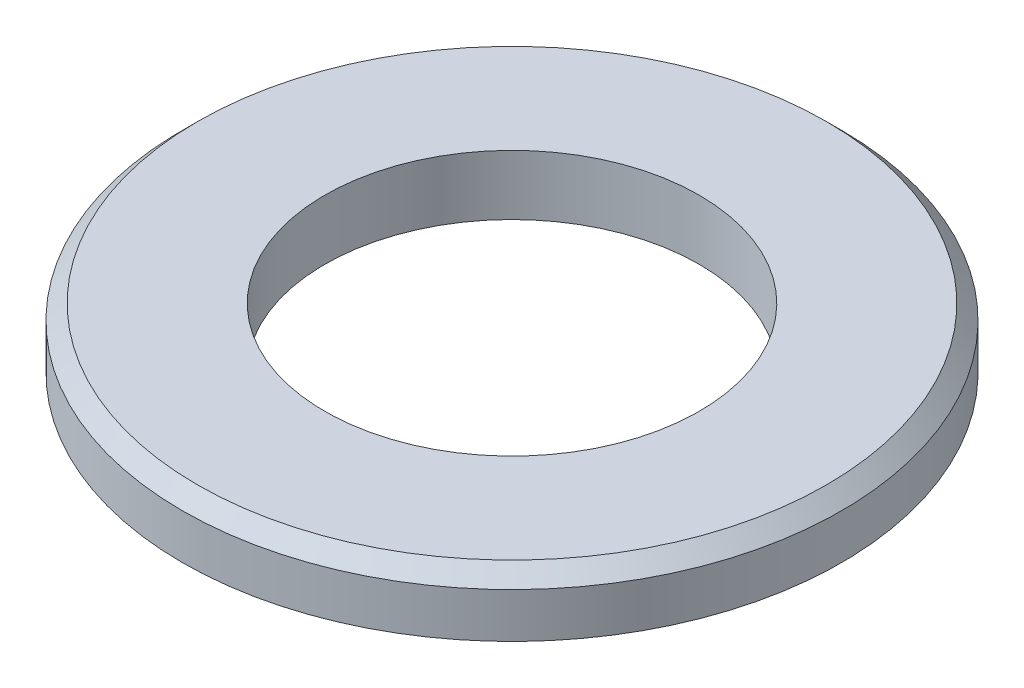
ISO-10303-21;
HEADER;
FILE_DESCRIPTION(('STEP AP214'),'2;1');
FILE_NAME('part.step','',(''),(''),'','','');
FILE_SCHEMA(('AUTOMOTIVE_DESIGN { 1 0 10303 214 1 1 1 1 }'));
ENDSEC;
DATA;
#1=APPLICATION_CONTEXT('core data for automotive mechanical design processes');
#2=APPLICATION_PROTOCOL_DEFINITION('international standard','automotive_design',2000,#1);
#3=PRODUCT_CONTEXT('',#1,'mechanical');
#4=PRODUCT('Part','Part','',(#3));
#5=PRODUCT_RELATED_PRODUCT_CATEGORY('part','',(#4));
#6=PRODUCT_DEFINITION_FORMATION('','',#4);
#7=PRODUCT_DEFINITION_CONTEXT('part definition',#1,'design');
#8=PRODUCT_DEFINITION('design','',#6,#7);
#9=PRODUCT_DEFINITION_SHAPE('','',#8);
#10=(LENGTH_UNIT() NAMED_UNIT(*) SI_UNIT(.MILLI.,.METRE.));
#11=(NAMED_UNIT(*) PLANE_ANGLE_UNIT() SI_UNIT($,.RADIAN.));
#12=(NAMED_UNIT(*) SI_UNIT($,.STERADIAN.) SOLID_ANGLE_UNIT());
#13=UNCERTAINTY_MEASURE_WITH_UNIT(LENGTH_MEASURE(1.E-05),#10,'distance_accuracy_value','');
#14=(GEOMETRIC_REPRESENTATION_CONTEXT(3) GLOBAL_UNCERTAINTY_ASSIGNED_CONTEXT((#13)) GLOBAL_UNIT_ASSIGNED_CONTEXT((#10,
#11,#12)) REPRESENTATION_CONTEXT('',''));
#15=CARTESIAN_POINT('',(0.,0.,0.));
#16=DIRECTION('',(0.,0.,1.));
#17=DIRECTION('',(1.,0.,0.));
#18=AXIS2_PLACEMENT_3D('',#15,#16,#17);
#19=CARTESIAN_POINT('',(0.,0.,0.));
#20=DIRECTION('',(0.,-1.,0.));
#21=DIRECTION('',(0.,0.,-1.));
#22=AXIS2_PLACEMENT_3D('',#19,#20,#21);
#23=CYLINDRICAL_SURFACE('',#22,12.5);
#24=CARTESIAN_POINT('',(0.,12.6445070422535,0.));
#25=DIRECTION('',(0.,-1.,0.));
#26=DIRECTION('',(0.,0.,-1.));
#27=AXIS2_PLACEMENT_3D('',#24,#25,#26);
#28=CIRCLE('',#27,12.5);
#29=CARTESIAN_POINT('',(0.,12.6445070422535,-12.5));
#30=VERTEX_POINT('',#29);
#31=EDGE_CURVE('E10',#30,#30,#28,.T.);
#32=ORIENTED_EDGE('',*,*,#31,.F.);
#33=EDGE_LOOP('',(#32));
#34=FACE_BOUND('',#33,.T.);
#35=CARTESIAN_POINT('',(0.,8.64450704225353,0.));
#36=DIRECTION('',(0.,-1.,0.));
#37=DIRECTION('',(0.,0.,-1.));
#38=AXIS2_PLACEMENT_3D('',#35,#36,#37);
#39=CIRCLE('',#38,12.5);
#40=CARTESIAN_POINT('',(0.,8.64450704225353,-12.5));
#41=VERTEX_POINT('',#40);
#42=EDGE_CURVE('E58',#41,#41,#39,.T.);
#43=ORIENTED_EDGE('',*,*,#42,.T.);
#44=EDGE_LOOP('',(#43));
#45=FACE_BOUND('',#44,.T.);
#46=ADVANCED_FACE('F39',(#34,#45),#23,.F.);
#47=CARTESIAN_POINT('',(-12.5,12.6445070422535,0.));
#48=DIRECTION('',(0.,-1.,0.));
#49=DIRECTION('',(0.,0.,-1.));
#50=AXIS2_PLACEMENT_3D('',#47,#48,#49);
#51=PLANE('',#50);
#52=CARTESIAN_POINT('',(0.,12.6445070422535,0.));
#53=DIRECTION('',(0.,-1.,0.));
#54=DIRECTION('',(0.,0.,-1.));
#55=AXIS2_PLACEMENT_3D('',#52,#53,#54);
#56=CIRCLE('',#55,21.);
#57=CARTESIAN_POINT('',(0.,12.6445070422535,-21.));
#58=VERTEX_POINT('',#57);
#59=EDGE_CURVE('E45',#58,#58,#56,.T.);
#60=ORIENTED_EDGE('',*,*,#59,.F.);
#61=EDGE_LOOP('',(#60));
#62=FACE_BOUND('',#61,.T.);
#63=ORIENTED_EDGE('',*,*,#31,.T.);
#64=EDGE_LOOP('',(#63));
#65=FACE_BOUND('',#64,.T.);
#66=ADVANCED_FACE('F77',(#62,#65),#51,.F.);
#67=CARTESIAN_POINT('',(0.,12.6445070422535,0.));
#68=DIRECTION('',(0.,-1.,0.));
#69=DIRECTION('',(0.,0.,-1.));
#70=AXIS2_PLACEMENT_3D('',#67,#68,#69);
#71=CONICAL_SURFACE('',#70,21.,0.785398163397448);
#72=CARTESIAN_POINT('',(0.,11.6445070422535,0.));
#73=DIRECTION('',(0.,-1.,0.));
#74=DIRECTION('',(0.,0.,-1.));
#75=AXIS2_PLACEMENT_3D('',#72,#73,#74);
#76=CIRCLE('',#75,22.);
#77=CARTESIAN_POINT('',(0.,11.6445070422535,-22.));
#78=VERTEX_POINT('',#77);
#79=EDGE_CURVE('E49',#78,#78,#76,.T.);
#80=ORIENTED_EDGE('',*,*,#79,.F.);
#81=EDGE_LOOP('',(#80));
#82=FACE_BOUND('',#81,.T.);
#83=ORIENTED_EDGE('',*,*,#59,.T.);
#84=EDGE_LOOP('',(#83));
#85=FACE_BOUND('',#84,.T.);
#86=ADVANCED_FACE('F72',(#82,#85),#71,.T.);
#87=CARTESIAN_POINT('',(0.,0.,0.));
#88=DIRECTION('',(0.,-1.,0.));
#89=DIRECTION('',(0.,0.,-1.));
#90=AXIS2_PLACEMENT_3D('',#87,#88,#89);
#91=CYLINDRICAL_SURFACE('',#90,22.);
#92=CARTESIAN_POINT('',(0.,8.64450704225353,0.));
#93=DIRECTION('',(0.,-1.,0.));
#94=DIRECTION('',(0.,0.,-1.));
#95=AXIS2_PLACEMENT_3D('',#92,#93,#94);
#96=CIRCLE('',#95,22.);
#97=CARTESIAN_POINT('',(0.,8.64450704225353,-22.));
#98=VERTEX_POINT('',#97);
#99=EDGE_CURVE('E53',#98,#98,#96,.T.);
#100=ORIENTED_EDGE('',*,*,#99,.F.);
#101=EDGE_LOOP('',(#100));
#102=FACE_BOUND('',#101,.T.);
#103=ORIENTED_EDGE('',*,*,#79,.T.);
#104=EDGE_LOOP('',(#103));
#105=FACE_BOUND('',#104,.T.);
#106=ADVANCED_FACE('F66',(#102,#105),#91,.T.);
#107=CARTESIAN_POINT('',(-12.5,8.64450704225353,0.));
#108=DIRECTION('',(0.,1.,0.));
#109=DIRECTION('',(0.,0.,1.));
#110=AXIS2_PLACEMENT_3D('',#107,#108,#109);
#111=PLANE('',#110);
#112=ORIENTED_EDGE('',*,*,#42,.F.);
#113=EDGE_LOOP('',(#112));
#114=FACE_BOUND('',#113,.T.);
#115=ORIENTED_EDGE('',*,*,#99,.T.);
#116=EDGE_LOOP('',(#115));
#117=FACE_BOUND('',#116,.T.);
#118=ADVANCED_FACE('F63',(#114,#117),#111,.F.);
#119=CLOSED_SHELL('',(#46,#66,#86,#106,#118));
#120=MANIFOLD_SOLID_BREP('B2',#119);
#121=ADVANCED_BREP_SHAPE_REPRESENTATION('',(#18,#120),#14);
#122=SHAPE_DEFINITION_REPRESENTATION(#9,#121);
ENDSEC;
END-ISO-10303-21;
